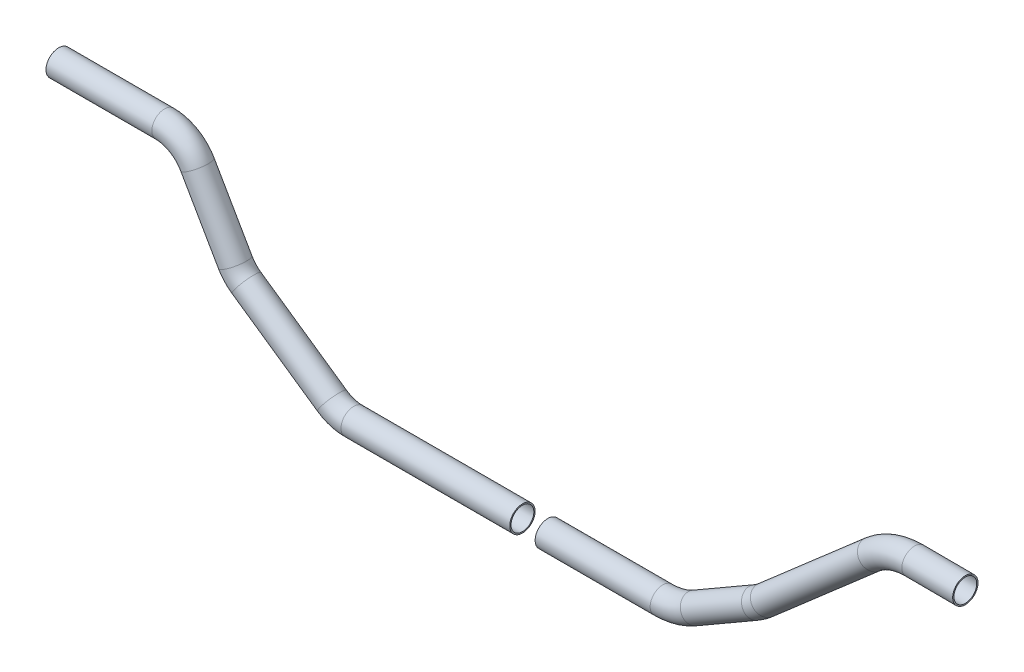
ISO-10303-21;
HEADER;
FILE_DESCRIPTION(('STEP AP214'),'2;1');
FILE_NAME('part.step','',(''),(''),'','','');
FILE_SCHEMA(('AUTOMOTIVE_DESIGN { 1 0 10303 214 1 1 1 1 }'));
ENDSEC;
DATA;
#1=APPLICATION_CONTEXT('core data for automotive mechanical design processes');
#2=APPLICATION_PROTOCOL_DEFINITION('international standard','automotive_design',2000,#1);
#3=PRODUCT_CONTEXT('',#1,'mechanical');
#4=PRODUCT('Part','Part','',(#3));
#5=PRODUCT_RELATED_PRODUCT_CATEGORY('part','',(#4));
#6=PRODUCT_DEFINITION_FORMATION('','',#4);
#7=PRODUCT_DEFINITION_CONTEXT('part definition',#1,'design');
#8=PRODUCT_DEFINITION('design','',#6,#7);
#9=PRODUCT_DEFINITION_SHAPE('','',#8);
#10=(LENGTH_UNIT() NAMED_UNIT(*) SI_UNIT(.MILLI.,.METRE.));
#11=(NAMED_UNIT(*) PLANE_ANGLE_UNIT() SI_UNIT($,.RADIAN.));
#12=(NAMED_UNIT(*) SI_UNIT($,.STERADIAN.) SOLID_ANGLE_UNIT());
#13=UNCERTAINTY_MEASURE_WITH_UNIT(LENGTH_MEASURE(1.E-05),#10,'distance_accuracy_value','');
#14=(GEOMETRIC_REPRESENTATION_CONTEXT(3) GLOBAL_UNCERTAINTY_ASSIGNED_CONTEXT((#13)) GLOBAL_UNIT_ASSIGNED_CONTEXT((#10,
#11,#12)) REPRESENTATION_CONTEXT('',''));
#15=CARTESIAN_POINT('',(0.,0.,0.));
#16=DIRECTION('',(0.,0.,1.));
#17=DIRECTION('',(1.,0.,0.));
#18=AXIS2_PLACEMENT_3D('',#15,#16,#17);
#19=CARTESIAN_POINT('',(30.0000000000037,-35.3695293030634,0.));
#20=DIRECTION('',(1.,0.,0.));
#21=DIRECTION('',(0.,1.,0.));
#22=AXIS2_PLACEMENT_3D('',#19,#20,#21);
#23=CYLINDRICAL_SURFACE('',#22,10.);
#24=CARTESIAN_POINT('',(-113.137610077227,-35.3695293030634,0.));
#25=DIRECTION('',(1.,0.,0.));
#26=DIRECTION('',(0.,0.,-1.));
#27=AXIS2_PLACEMENT_3D('',#24,#25,#26);
#28=CIRCLE('',#27,10.);
#29=CARTESIAN_POINT('',(-113.137610077227,-45.3695293030634,0.));
#30=VERTEX_POINT('',#29);
#31=EDGE_CURVE('E99',#30,#30,#28,.T.);
#32=ORIENTED_EDGE('',*,*,#31,.T.);
#33=EDGE_LOOP('',(#32));
#34=FACE_BOUND('',#33,.T.);
#35=CARTESIAN_POINT('',(20.000000000002,-35.3695293030633,0.));
#36=DIRECTION('',(-1.,0.,0.));
#37=DIRECTION('',(0.,-1.,0.));
#38=AXIS2_PLACEMENT_3D('',#35,#36,#37);
#39=CIRCLE('',#38,10.);
#40=CARTESIAN_POINT('',(20.000000000002,-45.3695293030633,0.));
#41=VERTEX_POINT('',#40);
#42=EDGE_CURVE('E67',#41,#41,#39,.T.);
#43=ORIENTED_EDGE('',*,*,#42,.T.);
#44=EDGE_LOOP('',(#43));
#45=FACE_BOUND('',#44,.T.);
#46=ADVANCED_FACE('F63',(#34,#45),#23,.T.);
#47=CARTESIAN_POINT('',(30.0000000000037,-35.3695293030634,0.));
#48=DIRECTION('',(1.,0.,0.));
#49=DIRECTION('',(0.,1.,0.));
#50=AXIS2_PLACEMENT_3D('',#47,#48,#49);
#51=CYLINDRICAL_SURFACE('',#50,9.);
#52=CARTESIAN_POINT('',(20.000000000002,-35.3695293030633,0.));
#53=DIRECTION('',(-1.,0.,0.));
#54=DIRECTION('',(0.,-1.,0.));
#55=AXIS2_PLACEMENT_3D('',#52,#53,#54);
#56=CIRCLE('',#55,9.);
#57=CARTESIAN_POINT('',(20.000000000002,-44.3695293030633,0.));
#58=VERTEX_POINT('',#57);
#59=EDGE_CURVE('E12',#58,#58,#56,.T.);
#60=ORIENTED_EDGE('',*,*,#59,.F.);
#61=EDGE_LOOP('',(#60));
#62=FACE_BOUND('',#61,.T.);
#63=CARTESIAN_POINT('',(-113.137610077227,-35.3695293030634,0.));
#64=DIRECTION('',(-1.,0.,0.));
#65=DIRECTION('',(0.,-1.,0.));
#66=AXIS2_PLACEMENT_3D('',#63,#64,#65);
#67=CIRCLE('',#66,9.);
#68=CARTESIAN_POINT('',(-113.137610077227,-44.3695293030634,0.));
#69=VERTEX_POINT('',#68);
#70=EDGE_CURVE('E82',#69,#69,#67,.F.);
#71=ORIENTED_EDGE('',*,*,#70,.F.);
#72=EDGE_LOOP('',(#71));
#73=FACE_BOUND('',#72,.T.);
#74=ADVANCED_FACE('F65',(#62,#73),#51,.F.);
#75=CARTESIAN_POINT('',(-345.844557130732,93.2555887111874,0.));
#76=DIRECTION('',(1.,0.,0.));
#77=DIRECTION('',(0.,0.,-1.));
#78=AXIS2_PLACEMENT_3D('',#75,#76,#77);
#79=PLANE('',#78);
#80=CARTESIAN_POINT('',(-345.844557130732,93.2555887111874,0.));
#81=DIRECTION('',(1.,0.,0.));
#82=DIRECTION('',(0.,0.,-1.));
#83=AXIS2_PLACEMENT_3D('',#80,#81,#82);
#84=CIRCLE('',#83,9.);
#85=CARTESIAN_POINT('',(-345.844557130732,93.2555887111874,-9.));
#86=VERTEX_POINT('',#85);
#87=EDGE_CURVE('E98',#86,#86,#84,.T.);
#88=ORIENTED_EDGE('',*,*,#87,.T.);
#89=EDGE_LOOP('',(#88));
#90=FACE_BOUND('',#89,.T.);
#91=CARTESIAN_POINT('',(-345.844557130732,93.2555887111874,0.));
#92=DIRECTION('',(1.,0.,0.));
#93=DIRECTION('',(0.,0.,-1.));
#94=AXIS2_PLACEMENT_3D('',#91,#92,#93);
#95=CIRCLE('',#94,10.);
#96=CARTESIAN_POINT('',(-345.844557130732,93.2555887111874,-10.));
#97=VERTEX_POINT('',#96);
#98=EDGE_CURVE('E79',#97,#97,#95,.T.);
#99=ORIENTED_EDGE('',*,*,#98,.F.);
#100=EDGE_LOOP('',(#99));
#101=FACE_BOUND('',#100,.T.);
#102=ADVANCED_FACE('F120',(#90,#101),#79,.F.);
#103=CARTESIAN_POINT('',(-113.137610077227,-5.36952930306338,0.));
#104=DIRECTION('',(0.,0.,-1.));
#105=DIRECTION('',(-1.,0.,0.));
#106=AXIS2_PLACEMENT_3D('',#103,#104,#105);
#107=TOROIDAL_SURFACE('',#106,30.,10.);
#108=CARTESIAN_POINT('',(-130.22224344056,-30.0295232779308,0.));
#109=DIRECTION('',(0.821999799162248,-0.569487778777757,0.));
#110=DIRECTION('',(0.,0.,-1.));
#111=AXIS2_PLACEMENT_3D('',#108,#109,#110);
#112=CIRCLE('',#111,10.);
#113=CARTESIAN_POINT('',(-135.917121228337,-38.2495212695534,0.));
#114=VERTEX_POINT('',#113);
#115=EDGE_CURVE('E95',#114,#114,#112,.T.);
#116=CARTESIAN_POINT('',(-113.137610077227,-5.36952930306338,0.));
#117=DIRECTION('',(0.,0.,-1.));
#118=DIRECTION('',(-1.,0.,0.));
#119=AXIS2_PLACEMENT_3D('',#116,#117,#118);
#120=CIRCLE('',#119,40.);
#121=EDGE_CURVE('',#30,#114,#120,.T.);
#122=ORIENTED_EDGE('',*,*,#31,.F.);
#123=ORIENTED_EDGE('',*,*,#115,.T.);
#124=ORIENTED_EDGE('',*,*,#121,.T.);
#125=ORIENTED_EDGE('',*,*,#121,.F.);
#126=EDGE_LOOP('',(#122,#124,#123,#125));
#127=FACE_BOUND('',#126,.T.);
#128=ADVANCED_FACE('F127',(#127),#107,.T.);
#129=CARTESIAN_POINT('',(-130.22224344056,-30.0295232779308,0.));
#130=DIRECTION('',(-0.821999799162248,0.569487778777757,0.));
#131=DIRECTION('',(-0.569487778777757,-0.821999799162249,0.));
#132=AXIS2_PLACEMENT_3D('',#129,#130,#131);
#133=CYLINDRICAL_SURFACE('',#132,10.);
#134=CARTESIAN_POINT('',(-197.656877085738,16.6897092163146,0.));
#135=DIRECTION('',(0.821999799162248,-0.569487778777757,0.));
#136=DIRECTION('',(0.,0.,-1.));
#137=AXIS2_PLACEMENT_3D('',#134,#135,#136);
#138=CIRCLE('',#137,10.);
#139=CARTESIAN_POINT('',(-203.351754873515,8.46971122469209,0.));
#140=VERTEX_POINT('',#139);
#141=EDGE_CURVE('E92',#140,#140,#138,.T.);
#142=ORIENTED_EDGE('',*,*,#141,.T.);
#143=EDGE_LOOP('',(#142));
#144=FACE_BOUND('',#143,.T.);
#145=ORIENTED_EDGE('',*,*,#115,.F.);
#146=EDGE_LOOP('',(#145));
#147=FACE_BOUND('',#146,.T.);
#148=ADVANCED_FACE('F155',(#144,#147),#133,.T.);
#149=CARTESIAN_POINT('',(-180.572243722405,41.349703191182,0.));
#150=DIRECTION('',(0.,0.,-1.));
#151=DIRECTION('',(-1.,0.,0.));
#152=AXIS2_PLACEMENT_3D('',#149,#150,#151);
#153=TOROIDAL_SURFACE('',#152,30.,10.);
#154=CARTESIAN_POINT('',(-206.586175299246,26.4073016467366,0.));
#155=DIRECTION('',(0.498080051481513,-0.867131052561361,0.));
#156=DIRECTION('',(0.,0.,-1.));
#157=AXIS2_PLACEMENT_3D('',#154,#155,#156);
#158=CIRCLE('',#157,10.);
#159=CARTESIAN_POINT('',(-215.257485824859,21.4265011319215,0.));
#160=VERTEX_POINT('',#159);
#161=EDGE_CURVE('E89',#160,#160,#158,.T.);
#162=CARTESIAN_POINT('',(-180.572243722405,41.349703191182,0.));
#163=DIRECTION('',(0.,0.,-1.));
#164=DIRECTION('',(-1.,0.,0.));
#165=AXIS2_PLACEMENT_3D('',#162,#163,#164);
#166=CIRCLE('',#165,40.);
#167=EDGE_CURVE('',#140,#160,#166,.T.);
#168=ORIENTED_EDGE('',*,*,#141,.F.);
#169=ORIENTED_EDGE('',*,*,#161,.T.);
#170=ORIENTED_EDGE('',*,*,#167,.T.);
#171=ORIENTED_EDGE('',*,*,#167,.F.);
#172=EDGE_LOOP('',(#168,#170,#169,#171));
#173=FACE_BOUND('',#172,.T.);
#174=ADVANCED_FACE('F151',(#173),#153,.T.);
#175=CARTESIAN_POINT('',(-206.586175299246,26.4073016467367,0.));
#176=DIRECTION('',(-0.498080051481514,0.86713105256136,0.));
#177=DIRECTION('',(-0.86713105256136,-0.498080051481514,0.));
#178=AXIS2_PLACEMENT_3D('',#175,#176,#177);
#179=CYLINDRICAL_SURFACE('',#178,10.);
#180=CARTESIAN_POINT('',(-236.33474533648,78.1979902556329,0.));
#181=DIRECTION('',(0.498080051481513,-0.867131052561361,0.));
#182=DIRECTION('',(0.,0.,-1.));
#183=AXIS2_PLACEMENT_3D('',#180,#181,#182);
#184=CIRCLE('',#183,10.);
#185=CARTESIAN_POINT('',(-227.663434810866,83.178790770448,0.));
#186=VERTEX_POINT('',#185);
#187=EDGE_CURVE('E86',#186,#186,#184,.T.);
#188=ORIENTED_EDGE('',*,*,#187,.T.);
#189=EDGE_LOOP('',(#188));
#190=FACE_BOUND('',#189,.T.);
#191=ORIENTED_EDGE('',*,*,#161,.F.);
#192=EDGE_LOOP('',(#191));
#193=FACE_BOUND('',#192,.T.);
#194=ADVANCED_FACE('F144',(#190,#193),#179,.T.);
#195=CARTESIAN_POINT('',(-262.348676913321,63.2555887111875,0.));
#196=DIRECTION('',(0.,0.,1.));
#197=DIRECTION('',(1.,0.,0.));
#198=AXIS2_PLACEMENT_3D('',#195,#196,#197);
#199=TOROIDAL_SURFACE('',#198,30.,10.);
#200=CARTESIAN_POINT('',(-262.348676913321,93.2555887111874,0.));
#201=DIRECTION('',(1.,0.,0.));
#202=DIRECTION('',(0.,0.,-1.));
#203=AXIS2_PLACEMENT_3D('',#200,#201,#202);
#204=CIRCLE('',#203,10.);
#205=CARTESIAN_POINT('',(-262.348676913321,103.255588711187,0.));
#206=VERTEX_POINT('',#205);
#207=EDGE_CURVE('E83',#206,#206,#204,.T.);
#208=CARTESIAN_POINT('',(-262.348676913321,63.2555887111875,0.));
#209=DIRECTION('',(0.,0.,1.));
#210=DIRECTION('',(1.,0.,0.));
#211=AXIS2_PLACEMENT_3D('',#208,#209,#210);
#212=CIRCLE('',#211,40.);
#213=EDGE_CURVE('',#186,#206,#212,.T.);
#214=ORIENTED_EDGE('',*,*,#187,.F.);
#215=ORIENTED_EDGE('',*,*,#207,.T.);
#216=ORIENTED_EDGE('',*,*,#213,.T.);
#217=ORIENTED_EDGE('',*,*,#213,.F.);
#218=EDGE_LOOP('',(#214,#216,#215,#217));
#219=FACE_BOUND('',#218,.T.);
#220=ADVANCED_FACE('F133',(#219),#199,.T.);
#221=CARTESIAN_POINT('',(-262.348676913321,93.2555887111875,0.));
#222=DIRECTION('',(-1.,0.,0.));
#223=DIRECTION('',(0.,-1.,0.));
#224=AXIS2_PLACEMENT_3D('',#221,#222,#223);
#225=CYLINDRICAL_SURFACE('',#224,10.);
#226=ORIENTED_EDGE('',*,*,#98,.T.);
#227=EDGE_LOOP('',(#226));
#228=FACE_BOUND('',#227,.T.);
#229=ORIENTED_EDGE('',*,*,#207,.F.);
#230=EDGE_LOOP('',(#229));
#231=FACE_BOUND('',#230,.T.);
#232=ADVANCED_FACE('F122',(#228,#231),#225,.T.);
#233=CARTESIAN_POINT('',(-113.137610077227,-5.36952930306338,0.));
#234=DIRECTION('',(0.,0.,-1.));
#235=DIRECTION('',(-1.,0.,0.));
#236=AXIS2_PLACEMENT_3D('',#233,#234,#235);
#237=TOROIDAL_SURFACE('',#236,30.,9.);
#238=CARTESIAN_POINT('',(-130.22224344056,-30.0295232779309,0.));
#239=DIRECTION('',(0.821999799162249,-0.569487778777756,0.));
#240=DIRECTION('',(0.569487778777756,0.821999799162249,0.));
#241=AXIS2_PLACEMENT_3D('',#238,#239,#240);
#242=CIRCLE('',#241,9.);
#243=CARTESIAN_POINT('',(-135.34763344956,-37.4275214703911,0.));
#244=VERTEX_POINT('',#243);
#245=EDGE_CURVE('E112',#244,#244,#242,.T.);
#246=CARTESIAN_POINT('',(-113.137610077227,-5.36952930306338,0.));
#247=DIRECTION('',(0.,0.,-1.));
#248=DIRECTION('',(-1.,0.,0.));
#249=AXIS2_PLACEMENT_3D('',#246,#247,#248);
#250=CIRCLE('',#249,39.);
#251=EDGE_CURVE('',#69,#244,#250,.T.);
#252=ORIENTED_EDGE('',*,*,#70,.T.);
#253=ORIENTED_EDGE('',*,*,#245,.F.);
#254=ORIENTED_EDGE('',*,*,#251,.T.);
#255=ORIENTED_EDGE('',*,*,#251,.F.);
#256=EDGE_LOOP('',(#252,#254,#253,#255));
#257=FACE_BOUND('',#256,.T.);
#258=ADVANCED_FACE('F117',(#257),#237,.F.);
#259=CARTESIAN_POINT('',(-130.22224344056,-30.0295232779308,0.));
#260=DIRECTION('',(-0.821999799162248,0.569487778777757,0.));
#261=DIRECTION('',(-0.569487778777757,-0.821999799162249,0.));
#262=AXIS2_PLACEMENT_3D('',#259,#260,#261);
#263=CYLINDRICAL_SURFACE('',#262,9.);
#264=CARTESIAN_POINT('',(-197.656877085738,16.6897092163146,0.));
#265=DIRECTION('',(-0.821999799162248,0.569487778777757,0.));
#266=DIRECTION('',(-0.569487778777757,-0.821999799162249,0.));
#267=AXIS2_PLACEMENT_3D('',#264,#265,#266);
#268=CIRCLE('',#267,9.);
#269=CARTESIAN_POINT('',(-202.782267094737,9.29171102385432,0.));
#270=VERTEX_POINT('',#269);
#271=EDGE_CURVE('E109',#270,#270,#268,.F.);
#272=CARTESIAN_POINT('',(-202.782267094737,9.29171102385432,0.));
#273=CARTESIAN_POINT('',(-202.079822994267,8.80505235203926,0.));
#274=CARTESIAN_POINT('',(-201.377378893796,8.31839368022421,0.));
#275=CARTESIAN_POINT('',(-199.972490692855,7.3450763365941,0.));
#276=CARTESIAN_POINT('',(-199.270046592384,6.85841766477904,0.));
#277=CARTESIAN_POINT('',(-197.865158391443,5.88510032114893,0.));
#278=CARTESIAN_POINT('',(-197.162714290973,5.39844164933388,0.));
#279=CARTESIAN_POINT('',(-195.757826090031,4.42512430570376,0.));
#280=CARTESIAN_POINT('',(-195.055381989561,3.9384656338887,0.));
#281=CARTESIAN_POINT('',(-193.65049378862,2.96514829025859,0.));
#282=CARTESIAN_POINT('',(-192.948049688149,2.47848961844353,0.));
#283=CARTESIAN_POINT('',(-191.543161487208,1.50517227481342,0.));
#284=CARTESIAN_POINT('',(-190.840717386737,1.01851360299836,0.));
#285=CARTESIAN_POINT('',(-189.435829185796,0.0451962593682555,0.));
#286=CARTESIAN_POINT('',(-188.733385085325,-0.441462412446796,0.));
#287=CARTESIAN_POINT('',(-187.328496884384,-1.41477975607691,0.));
#288=CARTESIAN_POINT('',(-186.626052783914,-1.90143842789197,0.));
#289=CARTESIAN_POINT('',(-185.221164582972,-2.87475577152209,0.));
#290=CARTESIAN_POINT('',(-184.518720482502,-3.36141444333714,0.));
#291=CARTESIAN_POINT('',(-183.11383228156,-4.33473178696725,0.));
#292=CARTESIAN_POINT('',(-182.41138818109,-4.82139045878231,0.));
#293=CARTESIAN_POINT('',(-181.006499980149,-5.79470780241242,0.));
#294=CARTESIAN_POINT('',(-180.304055879678,-6.28136647422748,0.));
#295=CARTESIAN_POINT('',(-178.899167678737,-7.25468381785759,0.));
#296=CARTESIAN_POINT('',(-178.196723578266,-7.74134248967265,0.));
#297=CARTESIAN_POINT('',(-176.791835377325,-8.71465983330276,0.));
#298=CARTESIAN_POINT('',(-176.089391276854,-9.20131850511782,0.));
#299=CARTESIAN_POINT('',(-174.684503075913,-10.1746358487479,0.));
#300=CARTESIAN_POINT('',(-173.982058975443,-10.661294520563,0.));
#301=CARTESIAN_POINT('',(-172.577170774501,-11.6346118641931,0.));
#302=CARTESIAN_POINT('',(-171.874726674031,-12.1212705360082,0.));
#303=CARTESIAN_POINT('',(-170.46983847309,-13.0945878796383,0.));
#304=CARTESIAN_POINT('',(-169.767394372619,-13.5812465514533,0.));
#305=CARTESIAN_POINT('',(-168.362506171678,-14.5545638950834,0.));
#306=CARTESIAN_POINT('',(-167.660062071207,-15.0412225668985,0.));
#307=CARTESIAN_POINT('',(-166.255173870266,-16.0145399105286,0.));
#308=CARTESIAN_POINT('',(-165.552729769795,-16.5011985823437,0.));
#309=CARTESIAN_POINT('',(-164.147841568854,-17.4745159259738,0.));
#310=CARTESIAN_POINT('',(-163.445397468384,-17.9611745977888,0.));
#311=CARTESIAN_POINT('',(-162.040509267442,-18.9344919414189,0.));
#312=CARTESIAN_POINT('',(-161.338065166972,-19.421150613234,0.));
#313=CARTESIAN_POINT('',(-159.933176966031,-20.3944679568641,0.));
#314=CARTESIAN_POINT('',(-159.23073286556,-20.8811266286792,0.));
#315=CARTESIAN_POINT('',(-157.825844664619,-21.8544439723093,0.));
#316=CARTESIAN_POINT('',(-157.123400564148,-22.3411026441243,0.));
#317=CARTESIAN_POINT('',(-155.718512363207,-23.3144199877545,0.));
#318=CARTESIAN_POINT('',(-155.016068262736,-23.8010786595695,0.));
#319=CARTESIAN_POINT('',(-153.611180061795,-24.7743960031996,0.));
#320=CARTESIAN_POINT('',(-152.908735961325,-25.2610546750147,0.));
#321=CARTESIAN_POINT('',(-151.503847760383,-26.2343720186448,0.));
#322=CARTESIAN_POINT('',(-150.801403659913,-26.7210306904598,0.));
#323=CARTESIAN_POINT('',(-149.396515458972,-27.69434803409,0.));
#324=CARTESIAN_POINT('',(-148.694071358501,-28.181006705905,0.));
#325=CARTESIAN_POINT('',(-147.28918315756,-29.1543240495351,0.));
#326=CARTESIAN_POINT('',(-146.586739057089,-29.6409827213502,0.));
#327=CARTESIAN_POINT('',(-145.181850856148,-30.6143000649803,0.));
#328=CARTESIAN_POINT('',(-144.479406755677,-31.1009587367953,0.));
#329=CARTESIAN_POINT('',(-143.074518554736,-32.0742760804255,0.));
#330=CARTESIAN_POINT('',(-142.372074454266,-32.5609347522405,0.));
#331=CARTESIAN_POINT('',(-140.967186253324,-33.5342520958706,0.));
#332=CARTESIAN_POINT('',(-140.264742152854,-34.0209107676857,0.));
#333=CARTESIAN_POINT('',(-138.859853951913,-34.9942281113158,0.));
#334=CARTESIAN_POINT('',(-138.157409851442,-35.4808867831309,0.));
#335=CARTESIAN_POINT('',(-136.752521650501,-36.454204126761,0.));
#336=CARTESIAN_POINT('',(-136.05007755003,-36.940862798576,0.));
#337=CARTESIAN_POINT('',(-135.34763344956,-37.4275214703911,0.));
#338=B_SPLINE_CURVE_WITH_KNOTS('',3,(#272,#273,#274,#275,#276,#277,#278,#279,#280,#281,#282,
#283,#284,#285,#286,#287,#288,#289,#290,#291,#292,#293,#294,#295,#296,#297,#298,#299,#300,#301,
#302,#303,#304,#305,#306,#307,#308,#309,#310,#311,#312,#313,#314,#315,#316,#317,#318,#319,#320,
#321,#322,#323,#324,#325,#326,#327,#328,#329,#330,#331,#332,#333,#334,#335,#336,#337),
.UNSPECIFIED.,.F.,.F.,(4,2,2,2,2,2,2,2,2,2,2,2,2,2,2,2,2,2,2,2,2,2,2,2,2,2,2,2,2,2,2,2,4),(0.,
2.56366522663329,5.1273304532666,7.69099567989989,10.2546609065332,12.8183261331665,
15.3819913597998,17.945656586433,20.5093218130663,23.0729870396996,25.6366522663329,
28.2003174929662,30.7639827195995,33.3276479462328,35.8913131728661,38.4549783994994,
41.0186436261327,43.582308852766,46.1459740793993,48.7096393060325,51.2733045326659,
53.8369697592992,56.4006349859324,58.9643002125657,61.527965439199,64.0916306658323,
66.6552958924656,69.2189611190989,71.7826263457322,74.3462915723655,76.9099567989988,
79.4736220256321,82.0372872522654),.UNSPECIFIED.);
#339=EDGE_CURVE('BSEAM140',#270,#244,#338,.T.);
#340=ORIENTED_EDGE('',*,*,#271,.F.);
#341=ORIENTED_EDGE('',*,*,#245,.T.);
#342=ORIENTED_EDGE('',*,*,#339,.T.);
#343=ORIENTED_EDGE('',*,*,#339,.F.);
#344=EDGE_LOOP('',(#340,#342,#341,#343));
#345=FACE_BOUND('',#344,.T.);
#346=ADVANCED_FACE('F140',(#345),#263,.F.);
#347=CARTESIAN_POINT('',(-180.572243722405,41.349703191182,0.));
#348=DIRECTION('',(0.,0.,-1.));
#349=DIRECTION('',(-1.,0.,0.));
#350=AXIS2_PLACEMENT_3D('',#347,#348,#349);
#351=TOROIDAL_SURFACE('',#350,30.,9.);
#352=CARTESIAN_POINT('',(-206.586175299246,26.4073016467366,0.));
#353=DIRECTION('',(0.498080051481514,-0.86713105256136,0.));
#354=DIRECTION('',(0.86713105256136,0.498080051481514,0.));
#355=AXIS2_PLACEMENT_3D('',#352,#353,#354);
#356=CIRCLE('',#355,9.);
#357=CARTESIAN_POINT('',(-214.390354772298,21.924581183403,0.));
#358=VERTEX_POINT('',#357);
#359=EDGE_CURVE('E106',#358,#358,#356,.T.);
#360=CARTESIAN_POINT('',(-180.572243722405,41.349703191182,0.));
#361=DIRECTION('',(0.,0.,-1.));
#362=DIRECTION('',(-1.,0.,0.));
#363=AXIS2_PLACEMENT_3D('',#360,#361,#362);
#364=CIRCLE('',#363,39.);
#365=EDGE_CURVE('',#270,#358,#364,.T.);
#366=ORIENTED_EDGE('',*,*,#271,.T.);
#367=ORIENTED_EDGE('',*,*,#359,.F.);
#368=ORIENTED_EDGE('',*,*,#365,.T.);
#369=ORIENTED_EDGE('',*,*,#365,.F.);
#370=EDGE_LOOP('',(#366,#368,#367,#369));
#371=FACE_BOUND('',#370,.T.);
#372=ADVANCED_FACE('F173',(#371),#351,.F.);
#373=CARTESIAN_POINT('',(-206.586175299246,26.4073016467367,0.));
#374=DIRECTION('',(-0.498080051481514,0.86713105256136,0.));
#375=DIRECTION('',(-0.86713105256136,-0.498080051481514,0.));
#376=AXIS2_PLACEMENT_3D('',#373,#374,#375);
#377=CYLINDRICAL_SURFACE('',#376,9.);
#378=CARTESIAN_POINT('',(-236.33474533648,78.1979902556329,0.));
#379=DIRECTION('',(-0.498080051481514,0.86713105256136,0.));
#380=DIRECTION('',(-0.86713105256136,-0.498080051481514,0.));
#381=AXIS2_PLACEMENT_3D('',#378,#379,#380);
#382=CIRCLE('',#381,9.);
#383=CARTESIAN_POINT('',(-228.530565863427,82.6807107189665,0.));
#384=VERTEX_POINT('',#383);
#385=EDGE_CURVE('E76',#384,#384,#382,.F.);
#386=ORIENTED_EDGE('',*,*,#385,.F.);
#387=EDGE_LOOP('',(#386));
#388=FACE_BOUND('',#387,.T.);
#389=ORIENTED_EDGE('',*,*,#359,.T.);
#390=EDGE_LOOP('',(#389));
#391=FACE_BOUND('',#390,.T.);
#392=ADVANCED_FACE('F169',(#388,#391),#377,.F.);
#393=CARTESIAN_POINT('',(-262.348676913321,63.2555887111875,0.));
#394=DIRECTION('',(0.,0.,1.));
#395=DIRECTION('',(1.,0.,0.));
#396=AXIS2_PLACEMENT_3D('',#393,#394,#395);
#397=TOROIDAL_SURFACE('',#396,30.,9.);
#398=CARTESIAN_POINT('',(-262.348676913321,93.2555887111874,0.));
#399=DIRECTION('',(1.,0.,0.));
#400=DIRECTION('',(0.,1.,0.));
#401=AXIS2_PLACEMENT_3D('',#398,#399,#400);
#402=CIRCLE('',#401,9.);
#403=CARTESIAN_POINT('',(-262.348676913321,102.255588711187,0.));
#404=VERTEX_POINT('',#403);
#405=EDGE_CURVE('E71',#404,#404,#402,.T.);
#406=CARTESIAN_POINT('',(-262.348676913321,63.2555887111875,0.));
#407=DIRECTION('',(0.,0.,1.));
#408=DIRECTION('',(1.,0.,0.));
#409=AXIS2_PLACEMENT_3D('',#406,#407,#408);
#410=CIRCLE('',#409,39.);
#411=EDGE_CURVE('',#384,#404,#410,.T.);
#412=ORIENTED_EDGE('',*,*,#385,.T.);
#413=ORIENTED_EDGE('',*,*,#405,.F.);
#414=ORIENTED_EDGE('',*,*,#411,.T.);
#415=ORIENTED_EDGE('',*,*,#411,.F.);
#416=EDGE_LOOP('',(#412,#414,#413,#415));
#417=FACE_BOUND('',#416,.T.);
#418=ADVANCED_FACE('F165',(#417),#397,.F.);
#419=CARTESIAN_POINT('',(-262.348676913321,93.2555887111875,0.));
#420=DIRECTION('',(-1.,0.,0.));
#421=DIRECTION('',(0.,-1.,0.));
#422=AXIS2_PLACEMENT_3D('',#419,#420,#421);
#423=CYLINDRICAL_SURFACE('',#422,9.);
#424=ORIENTED_EDGE('',*,*,#87,.F.);
#425=EDGE_LOOP('',(#424));
#426=FACE_BOUND('',#425,.T.);
#427=ORIENTED_EDGE('',*,*,#405,.T.);
#428=EDGE_LOOP('',(#427));
#429=FACE_BOUND('',#428,.T.);
#430=ADVANCED_FACE('F130',(#426,#429),#423,.F.);
#431=CARTESIAN_POINT('',(20.000000000002,-15.8292536902672,-10.));
#432=DIRECTION('',(-1.,0.,0.));
#433=DIRECTION('',(0.,-1.,0.));
#434=AXIS2_PLACEMENT_3D('',#431,#432,#433);
#435=PLANE('',#434);
#436=ORIENTED_EDGE('',*,*,#59,.T.);
#437=EDGE_LOOP('',(#436));
#438=FACE_BOUND('',#437,.T.);
#439=ORIENTED_EDGE('',*,*,#42,.F.);
#440=EDGE_LOOP('',(#439));
#441=FACE_BOUND('',#440,.T.);
#442=ADVANCED_FACE('F143',(#438,#441),#435,.F.);
#443=CLOSED_SHELL('',(#46,#74,#102,#128,#148,#174,#194,#220,#232,#258,#346,#372,#392,#418,#430,#442));
#444=MANIFOLD_SOLID_BREP('B2',#443);
#445=CARTESIAN_POINT('',(329.28564185792,90.5046449903837,0.));
#446=DIRECTION('',(0.999989067430513,-0.0046760046464724,0.));
#447=DIRECTION('',(0.0046760046464724,0.999989067430513,0.));
#448=AXIS2_PLACEMENT_3D('',#445,#446,#447);
#449=CYLINDRICAL_SURFACE('',#448,10.);
#450=CARTESIAN_POINT('',(369.35801180061,90.3172643537847,0.));
#451=DIRECTION('',(-0.999989067430513,0.00467600464647312,0.));
#452=DIRECTION('',(-0.00467600464647312,-0.999989067430513,0.));
#453=AXIS2_PLACEMENT_3D('',#450,#451,#452);
#454=CIRCLE('',#453,10.);
#455=CARTESIAN_POINT('',(369.404771847075,100.31715502809,0.));
#456=VERTEX_POINT('',#455);
#457=EDGE_CURVE('E62',#456,#456,#454,.T.);
#458=CARTESIAN_POINT('',(329.28564185792,90.5046449903836,0.));
#459=DIRECTION('',(-0.999989067430513,0.00467600464647312,0.));
#460=DIRECTION('',(-0.00467600464647312,-0.999989067430513,0.));
#461=AXIS2_PLACEMENT_3D('',#458,#459,#460);
#462=CIRCLE('',#461,10.);
#463=CARTESIAN_POINT('',(329.332401904385,100.504535664689,0.));
#464=VERTEX_POINT('',#463);
#465=EDGE_CURVE('E319',#464,#464,#462,.T.);
#466=CARTESIAN_POINT('',(369.404771847075,100.31715502809,0.));
#467=CARTESIAN_POINT('',(368.987351326839,100.319106909721,0.));
#468=CARTESIAN_POINT('',(368.569930806602,100.321058791352,0.));
#469=CARTESIAN_POINT('',(367.73508976613,100.324962554615,0.));
#470=CARTESIAN_POINT('',(367.317669245893,100.326914436246,0.));
#471=CARTESIAN_POINT('',(366.482828205421,100.330818199508,0.));
#472=CARTESIAN_POINT('',(366.065407685184,100.33277008114,0.));
#473=CARTESIAN_POINT('',(365.230566644711,100.336673844402,0.));
#474=CARTESIAN_POINT('',(364.813146124475,100.338625726033,0.));
#475=CARTESIAN_POINT('',(363.978305084002,100.342529489296,0.));
#476=CARTESIAN_POINT('',(363.560884563766,100.344481370927,0.));
#477=CARTESIAN_POINT('',(362.726043523293,100.34838513419,0.));
#478=CARTESIAN_POINT('',(362.308623003057,100.350337015821,0.));
#479=CARTESIAN_POINT('',(361.473781962584,100.354240779083,0.));
#480=CARTESIAN_POINT('',(361.056361442348,100.356192660715,0.));
#481=CARTESIAN_POINT('',(360.221520401875,100.360096423977,0.));
#482=CARTESIAN_POINT('',(359.804099881639,100.362048305608,0.));
#483=CARTESIAN_POINT('',(358.969258841166,100.365952068871,0.));
#484=CARTESIAN_POINT('',(358.55183832093,100.367903950502,0.));
#485=CARTESIAN_POINT('',(357.716997280457,100.371807713765,0.));
#486=CARTESIAN_POINT('',(357.299576760221,100.373759595396,0.));
#487=CARTESIAN_POINT('',(356.464735719748,100.377663358658,0.));
#488=CARTESIAN_POINT('',(356.047315199512,100.379615240289,0.));
#489=CARTESIAN_POINT('',(355.212474159039,100.383519003552,0.));
#490=CARTESIAN_POINT('',(354.795053638803,100.385470885183,0.));
#491=CARTESIAN_POINT('',(353.96021259833,100.389374648446,0.));
#492=CARTESIAN_POINT('',(353.542792078093,100.391326530077,0.));
#493=CARTESIAN_POINT('',(352.707951037621,100.395230293339,0.));
#494=CARTESIAN_POINT('',(352.290530517384,100.397182174971,0.));
#495=CARTESIAN_POINT('',(351.455689476912,100.401085938233,0.));
#496=CARTESIAN_POINT('',(351.038268956675,100.403037819864,0.));
#497=CARTESIAN_POINT('',(350.203427916203,100.406941583127,0.));
#498=CARTESIAN_POINT('',(349.786007395966,100.408893464758,0.));
#499=CARTESIAN_POINT('',(348.951166355494,100.412797228021,0.));
#500=CARTESIAN_POINT('',(348.533745835257,100.414749109652,0.));
#501=CARTESIAN_POINT('',(347.698904794784,100.418652872914,0.));
#502=CARTESIAN_POINT('',(347.281484274548,100.420604754546,0.));
#503=CARTESIAN_POINT('',(346.446643234075,100.424508517808,0.));
#504=CARTESIAN_POINT('',(346.029222713839,100.426460399439,0.));
#505=CARTESIAN_POINT('',(345.194381673366,100.430364162702,0.));
#506=CARTESIAN_POINT('',(344.77696115313,100.432316044333,0.));
#507=CARTESIAN_POINT('',(343.942120112657,100.436219807595,0.));
#508=CARTESIAN_POINT('',(343.524699592421,100.438171689227,0.));
#509=CARTESIAN_POINT('',(342.689858551948,100.442075452489,0.));
#510=CARTESIAN_POINT('',(342.272438031712,100.44402733412,0.));
#511=CARTESIAN_POINT('',(341.437596991239,100.447931097383,0.));
#512=CARTESIAN_POINT('',(341.020176471003,100.449882979014,0.));
#513=CARTESIAN_POINT('',(340.18533543053,100.453786742277,0.));
#514=CARTESIAN_POINT('',(339.767914910294,100.455738623908,0.));
#515=CARTESIAN_POINT('',(338.933073869821,100.45964238717,0.));
#516=CARTESIAN_POINT('',(338.515653349585,100.461594268802,0.));
#517=CARTESIAN_POINT('',(337.680812309112,100.465498032064,0.));
#518=CARTESIAN_POINT('',(337.263391788876,100.467449913695,0.));
#519=CARTESIAN_POINT('',(336.428550748403,100.471353676958,0.));
#520=CARTESIAN_POINT('',(336.011130228166,100.473305558589,0.));
#521=CARTESIAN_POINT('',(335.176289187694,100.477209321851,0.));
#522=CARTESIAN_POINT('',(334.758868667457,100.479161203483,0.));
#523=CARTESIAN_POINT('',(333.924027626985,100.483064966745,0.));
#524=CARTESIAN_POINT('',(333.506607106748,100.485016848376,0.));
#525=CARTESIAN_POINT('',(332.671766066276,100.488920611639,0.));
#526=CARTESIAN_POINT('',(332.254345546039,100.49087249327,0.));
#527=CARTESIAN_POINT('',(331.419504505567,100.494776256533,0.));
#528=CARTESIAN_POINT('',(331.00208398533,100.496728138164,0.));
#529=CARTESIAN_POINT('',(330.167242944857,100.500631901426,0.));
#530=CARTESIAN_POINT('',(329.749822424621,100.502583783058,0.));
#531=CARTESIAN_POINT('',(329.332401904385,100.504535664689,0.));
#532=B_SPLINE_CURVE_WITH_KNOTS('',3,(#466,#467,#468,#469,#470,#471,#472,#473,#474,#475,#476,
#477,#478,#479,#480,#481,#482,#483,#484,#485,#486,#487,#488,#489,#490,#491,#492,#493,#494,#495,
#496,#497,#498,#499,#500,#501,#502,#503,#504,#505,#506,#507,#508,#509,#510,#511,#512,#513,#514,
#515,#516,#517,#518,#519,#520,#521,#522,#523,#524,#525,#526,#527,#528,#529,#530,#531),
.UNSPECIFIED.,.F.,.F.,(4,2,2,2,2,2,2,2,2,2,2,2,2,2,2,2,2,2,2,2,2,2,2,2,2,2,2,2,2,2,2,2,4),(0.,
1.25227525129527,2.50455050259054,3.75682575388581,5.00910100518108,6.26137625647635,
7.51365150777162,8.76592675906688,10.0182020103622,11.2704772616574,12.5227525129527,
13.775027764248,15.0273030155433,16.2795782668386,17.5318535181338,18.7841287694291,
20.0364040207244,21.2886792720196,22.5409545233149,23.7932297746102,25.0455050259054,
26.2977802772008,27.550055528496,28.8023307797913,30.0546060310866,31.3068812823818,
32.5591565336771,33.8114317849724,35.0637070362677,36.3159822875629,37.5682575388582,
38.8205327901535,40.0728080414487),.UNSPECIFIED.);
#533=EDGE_CURVE('BSEAM311',#456,#464,#532,.T.);
#534=ORIENTED_EDGE('',*,*,#457,.T.);
#535=ORIENTED_EDGE('',*,*,#465,.F.);
#536=ORIENTED_EDGE('',*,*,#533,.T.);
#537=ORIENTED_EDGE('',*,*,#533,.F.);
#538=EDGE_LOOP('',(#534,#536,#535,#537));
#539=FACE_BOUND('',#538,.T.);
#540=ADVANCED_FACE('F311',(#539),#449,.T.);
#541=CARTESIAN_POINT('',(329.051841625597,40.505191618858,0.));
#542=DIRECTION('',(0.,0.,-1.));
#543=DIRECTION('',(-1.,0.,0.));
#544=AXIS2_PLACEMENT_3D('',#541,#542,#543);
#545=TOROIDAL_SURFACE('',#544,50.0000000000001,10.);
#546=CARTESIAN_POINT('',(296.234525798211,78.2281790653165,0.));
#547=DIRECTION('',(-0.75445974892917,-0.6563463165477,0.));
#548=DIRECTION('',(0.6563463165477,-0.75445974892917,0.));
#549=AXIS2_PLACEMENT_3D('',#546,#547,#548);
#550=CIRCLE('',#549,10.);
#551=CARTESIAN_POINT('',(289.671062632734,85.7727765546082,0.));
#552=VERTEX_POINT('',#551);
#553=EDGE_CURVE('E323',#552,#552,#550,.T.);
#554=CARTESIAN_POINT('',(329.051841625597,40.505191618858,0.));
#555=DIRECTION('',(0.,0.,-1.));
#556=DIRECTION('',(-1.,0.,0.));
#557=AXIS2_PLACEMENT_3D('',#554,#555,#556);
#558=CIRCLE('',#557,60.0000000000001);
#559=EDGE_CURVE('',#552,#464,#558,.T.);
#560=ORIENTED_EDGE('',*,*,#553,.F.);
#561=ORIENTED_EDGE('',*,*,#465,.T.);
#562=ORIENTED_EDGE('',*,*,#559,.T.);
#563=ORIENTED_EDGE('',*,*,#559,.F.);
#564=EDGE_LOOP('',(#560,#562,#561,#563));
#565=FACE_BOUND('',#564,.T.);
#566=ADVANCED_FACE('F390',(#565),#545,.T.);
#567=CARTESIAN_POINT('',(211.793997813692,4.7686875700515,0.));
#568=DIRECTION('',(0.754459748929169,0.656346316547701,0.));
#569=DIRECTION('',(-0.656346316547701,0.75445974892917,0.));
#570=AXIS2_PLACEMENT_3D('',#567,#568,#569);
#571=CYLINDRICAL_SURFACE('',#570,10.);
#572=ORIENTED_EDGE('',*,*,#553,.T.);
#573=EDGE_LOOP('',(#572));
#574=FACE_BOUND('',#573,.T.);
#575=CARTESIAN_POINT('',(211.793997813692,4.7686875700515,0.));
#576=DIRECTION('',(-0.75445974892917,-0.6563463165477,0.));
#577=DIRECTION('',(0.6563463165477,-0.75445974892917,0.));
#578=AXIS2_PLACEMENT_3D('',#575,#576,#577);
#579=CIRCLE('',#578,10.);
#580=CARTESIAN_POINT('',(218.357460979169,-2.77590991924023,0.));
#581=VERTEX_POINT('',#580);
#582=EDGE_CURVE('E328',#581,#581,#579,.T.);
#583=ORIENTED_EDGE('',*,*,#582,.F.);
#584=EDGE_LOOP('',(#583));
#585=FACE_BOUND('',#584,.T.);
#586=ADVANCED_FACE('F394',(#574,#585),#571,.T.);
#587=CARTESIAN_POINT('',(178.976681986307,42.49167501651,0.));
#588=DIRECTION('',(0.,0.,1.));
#589=DIRECTION('',(1.,0.,0.));
#590=AXIS2_PLACEMENT_3D('',#587,#588,#589);
#591=TOROIDAL_SURFACE('',#590,50.,10.);
#592=CARTESIAN_POINT('',(203.976681986307,-0.809595172711897,0.));
#593=DIRECTION('',(-0.866025403784438,-0.500000000000001,0.));
#594=DIRECTION('',(0.500000000000001,-0.866025403784438,0.));
#595=AXIS2_PLACEMENT_3D('',#592,#593,#594);
#596=CIRCLE('',#595,10.);
#597=CARTESIAN_POINT('',(208.976681986307,-9.46984921055631,0.));
#598=VERTEX_POINT('',#597);
#599=EDGE_CURVE('E331',#598,#598,#596,.T.);
#600=CARTESIAN_POINT('',(178.976681986307,42.49167501651,0.));
#601=DIRECTION('',(0.,0.,1.));
#602=DIRECTION('',(1.,0.,0.));
#603=AXIS2_PLACEMENT_3D('',#600,#601,#602);
#604=CIRCLE('',#603,60.);
#605=EDGE_CURVE('',#598,#581,#604,.T.);
#606=ORIENTED_EDGE('',*,*,#599,.F.);
#607=ORIENTED_EDGE('',*,*,#582,.T.);
#608=ORIENTED_EDGE('',*,*,#605,.T.);
#609=ORIENTED_EDGE('',*,*,#605,.F.);
#610=EDGE_LOOP('',(#606,#608,#607,#609));
#611=FACE_BOUND('',#610,.T.);
#612=ADVANCED_FACE('F401',(#611),#591,.T.);
#613=CARTESIAN_POINT('',(155.719660544748,-28.6707994922861,0.));
#614=DIRECTION('',(0.866025403784438,0.500000000000001,0.));
#615=DIRECTION('',(-0.500000000000001,0.866025403784438,0.));
#616=AXIS2_PLACEMENT_3D('',#613,#614,#615);
#617=CYLINDRICAL_SURFACE('',#616,10.);
#618=ORIENTED_EDGE('',*,*,#599,.T.);
#619=EDGE_LOOP('',(#618));
#620=FACE_BOUND('',#619,.T.);
#621=CARTESIAN_POINT('',(155.719660544748,-28.6707994922861,0.));
#622=DIRECTION('',(-0.866025403784439,-0.500000000000001,0.));
#623=DIRECTION('',(0.5,-0.866025403784439,0.));
#624=AXIS2_PLACEMENT_3D('',#621,#622,#623);
#625=CIRCLE('',#624,10.);
#626=CARTESIAN_POINT('',(160.719660544748,-37.3310535301305,0.));
#627=VERTEX_POINT('',#626);
#628=EDGE_CURVE('E334',#627,#627,#625,.T.);
#629=ORIENTED_EDGE('',*,*,#628,.F.);
#630=EDGE_LOOP('',(#629));
#631=FACE_BOUND('',#630,.T.);
#632=ADVANCED_FACE('F405',(#620,#631),#617,.T.);
#633=CARTESIAN_POINT('',(130.719660544748,14.6304706969358,0.));
#634=DIRECTION('',(0.,0.,1.));
#635=DIRECTION('',(1.,0.,0.));
#636=AXIS2_PLACEMENT_3D('',#633,#634,#635);
#637=TOROIDAL_SURFACE('',#636,50.,10.);
#638=CARTESIAN_POINT('',(130.719660544748,-35.3695293030643,0.));
#639=DIRECTION('',(-1.,0.,0.));
#640=DIRECTION('',(0.,-1.,0.));
#641=AXIS2_PLACEMENT_3D('',#638,#639,#640);
#642=CIRCLE('',#641,10.);
#643=CARTESIAN_POINT('',(130.719660544747,-45.3695293030642,0.));
#644=VERTEX_POINT('',#643);
#645=EDGE_CURVE('E337',#644,#644,#642,.T.);
#646=CARTESIAN_POINT('',(130.719660544748,14.6304706969358,0.));
#647=DIRECTION('',(0.,0.,1.));
#648=DIRECTION('',(1.,0.,0.));
#649=AXIS2_PLACEMENT_3D('',#646,#647,#648);
#650=CIRCLE('',#649,60.);
#651=EDGE_CURVE('',#644,#627,#650,.T.);
#652=ORIENTED_EDGE('',*,*,#645,.F.);
#653=ORIENTED_EDGE('',*,*,#628,.T.);
#654=ORIENTED_EDGE('',*,*,#651,.T.);
#655=ORIENTED_EDGE('',*,*,#651,.F.);
#656=EDGE_LOOP('',(#652,#654,#653,#655));
#657=FACE_BOUND('',#656,.T.);
#658=ADVANCED_FACE('F409',(#657),#637,.T.);
#659=CARTESIAN_POINT('',(30.0000000000037,-35.3695293030634,0.));
#660=DIRECTION('',(1.,0.,0.));
#661=DIRECTION('',(0.,1.,0.));
#662=AXIS2_PLACEMENT_3D('',#659,#660,#661);
#663=CYLINDRICAL_SURFACE('',#662,10.);
#664=CARTESIAN_POINT('',(40.000000000002,-35.3695293030635,0.));
#665=DIRECTION('',(1.,0.,0.));
#666=DIRECTION('',(0.,0.,-1.));
#667=AXIS2_PLACEMENT_3D('',#664,#665,#666);
#668=CIRCLE('',#667,10.);
#669=CARTESIAN_POINT('',(40.000000000002,-35.3695293030635,-10.));
#670=VERTEX_POINT('',#669);
#671=EDGE_CURVE('E361',#670,#670,#668,.T.);
#672=ORIENTED_EDGE('',*,*,#671,.T.);
#673=EDGE_LOOP('',(#672));
#674=FACE_BOUND('',#673,.T.);
#675=ORIENTED_EDGE('',*,*,#645,.T.);
#676=EDGE_LOOP('',(#675));
#677=FACE_BOUND('',#676,.T.);
#678=ADVANCED_FACE('F413',(#674,#677),#663,.T.);
#679=CARTESIAN_POINT('',(369.35801180061,90.3172643537847,0.));
#680=DIRECTION('',(-0.999989067430513,0.00467600464647312,0.));
#681=DIRECTION('',(-0.00467600464647312,-0.999989067430513,0.));
#682=AXIS2_PLACEMENT_3D('',#679,#680,#681);
#683=PLANE('',#682);
#684=CARTESIAN_POINT('',(369.35801180061,90.3172643537847,0.));
#685=DIRECTION('',(-0.999989067430513,0.00467600464647312,0.));
#686=DIRECTION('',(-0.00467600464647312,-0.999989067430513,0.));
#687=AXIS2_PLACEMENT_3D('',#684,#685,#686);
#688=CIRCLE('',#687,9.);
#689=CARTESIAN_POINT('',(369.400095842429,99.3171659606593,0.));
#690=VERTEX_POINT('',#689);
#691=EDGE_CURVE('E340',#690,#690,#688,.T.);
#692=ORIENTED_EDGE('',*,*,#691,.T.);
#693=EDGE_LOOP('',(#692));
#694=FACE_BOUND('',#693,.T.);
#695=ORIENTED_EDGE('',*,*,#457,.F.);
#696=EDGE_LOOP('',(#695));
#697=FACE_BOUND('',#696,.T.);
#698=ADVANCED_FACE('F313',(#694,#697),#683,.F.);
#699=CARTESIAN_POINT('',(329.28564185792,90.5046449903837,0.));
#700=DIRECTION('',(0.999989067430513,-0.0046760046464724,0.));
#701=DIRECTION('',(0.0046760046464724,0.999989067430513,0.));
#702=AXIS2_PLACEMENT_3D('',#699,#700,#701);
#703=CYLINDRICAL_SURFACE('',#702,9.);
#704=CARTESIAN_POINT('',(329.28564185792,90.5046449903837,0.));
#705=DIRECTION('',(-0.999989067430513,0.00467600464647089,0.));
#706=DIRECTION('',(-0.00467600464647089,-0.999989067430513,0.));
#707=AXIS2_PLACEMENT_3D('',#704,#705,#706);
#708=CIRCLE('',#707,9.);
#709=CARTESIAN_POINT('',(329.327725899738,99.5045465972583,0.));
#710=VERTEX_POINT('',#709);
#711=EDGE_CURVE('E343',#710,#710,#708,.T.);
#712=CARTESIAN_POINT('',(369.400095842429,99.3171659606593,0.));
#713=CARTESIAN_POINT('',(368.982675322192,99.3191178422905,0.));
#714=CARTESIAN_POINT('',(368.565254801956,99.3210697239218,0.));
#715=CARTESIAN_POINT('',(367.730413761483,99.3249734871843,0.));
#716=CARTESIAN_POINT('',(367.312993241247,99.3269253688155,0.));
#717=CARTESIAN_POINT('',(366.478152200774,99.330829132078,0.));
#718=CARTESIAN_POINT('',(366.060731680538,99.3327810137092,0.));
#719=CARTESIAN_POINT('',(365.225890640065,99.3366847769717,0.));
#720=CARTESIAN_POINT('',(364.808470119829,99.3386366586029,0.));
#721=CARTESIAN_POINT('',(363.973629079356,99.3425404218654,0.));
#722=CARTESIAN_POINT('',(363.55620855912,99.3444923034966,0.));
#723=CARTESIAN_POINT('',(362.721367518647,99.3483960667591,0.));
#724=CARTESIAN_POINT('',(362.30394699841,99.3503479483904,0.));
#725=CARTESIAN_POINT('',(361.469105957938,99.3542517116528,0.));
#726=CARTESIAN_POINT('',(361.051685437701,99.3562035932841,0.));
#727=CARTESIAN_POINT('',(360.216844397229,99.3601073565466,0.));
#728=CARTESIAN_POINT('',(359.799423876992,99.3620592381778,0.));
#729=CARTESIAN_POINT('',(358.96458283652,99.3659630014403,0.));
#730=CARTESIAN_POINT('',(358.547162316283,99.3679148830715,0.));
#731=CARTESIAN_POINT('',(357.712321275811,99.371818646334,0.));
#732=CARTESIAN_POINT('',(357.294900755574,99.3737705279652,0.));
#733=CARTESIAN_POINT('',(356.460059715102,99.3776742912277,0.));
#734=CARTESIAN_POINT('',(356.042639194865,99.379626172859,0.));
#735=CARTESIAN_POINT('',(355.207798154392,99.3835299361214,0.));
#736=CARTESIAN_POINT('',(354.790377634156,99.3854818177527,0.));
#737=CARTESIAN_POINT('',(353.955536593683,99.3893855810151,0.));
#738=CARTESIAN_POINT('',(353.538116073447,99.3913374626464,0.));
#739=CARTESIAN_POINT('',(352.703275032974,99.3952412259089,0.));
#740=CARTESIAN_POINT('',(352.285854512738,99.3971931075401,0.));
#741=CARTESIAN_POINT('',(351.451013472265,99.4010968708026,0.));
#742=CARTESIAN_POINT('',(351.033592952029,99.4030487524338,0.));
#743=CARTESIAN_POINT('',(350.198751911556,99.4069525156963,0.));
#744=CARTESIAN_POINT('',(349.78133139132,99.4089043973275,0.));
#745=CARTESIAN_POINT('',(348.946490350847,99.41280816059,0.));
#746=CARTESIAN_POINT('',(348.529069830611,99.4147600422213,0.));
#747=CARTESIAN_POINT('',(347.694228790138,99.4186638054838,0.));
#748=CARTESIAN_POINT('',(347.276808269902,99.420615687115,0.));
#749=CARTESIAN_POINT('',(346.441967229429,99.4245194503775,0.));
#750=CARTESIAN_POINT('',(346.024546709193,99.4264713320087,0.));
#751=CARTESIAN_POINT('',(345.18970566872,99.4303750952712,0.));
#752=CARTESIAN_POINT('',(344.772285148483,99.4323269769024,0.));
#753=CARTESIAN_POINT('',(343.937444108011,99.4362307401649,0.));
#754=CARTESIAN_POINT('',(343.520023587774,99.4381826217961,0.));
#755=CARTESIAN_POINT('',(342.685182547302,99.4420863850586,0.));
#756=CARTESIAN_POINT('',(342.267762027065,99.4440382666899,0.));
#757=CARTESIAN_POINT('',(341.432920986593,99.4479420299523,0.));
#758=CARTESIAN_POINT('',(341.015500466356,99.4498939115836,0.));
#759=CARTESIAN_POINT('',(340.180659425884,99.4537976748461,0.));
#760=CARTESIAN_POINT('',(339.763238905647,99.4557495564773,0.));
#761=CARTESIAN_POINT('',(338.928397865175,99.4596533197398,0.));
#762=CARTESIAN_POINT('',(338.510977344938,99.461605201371,0.));
#763=CARTESIAN_POINT('',(337.676136304465,99.4655089646335,0.));
#764=CARTESIAN_POINT('',(337.258715784229,99.4674608462647,0.));
#765=CARTESIAN_POINT('',(336.423874743756,99.4713646095272,0.));
#766=CARTESIAN_POINT('',(336.00645422352,99.4733164911585,0.));
#767=CARTESIAN_POINT('',(335.171613183047,99.4772202544209,0.));
#768=CARTESIAN_POINT('',(334.754192662811,99.4791721360522,0.));
#769=CARTESIAN_POINT('',(333.919351622338,99.4830758993147,0.));
#770=CARTESIAN_POINT('',(333.501931102102,99.4850277809459,0.));
#771=CARTESIAN_POINT('',(332.667090061629,99.4889315442084,0.));
#772=CARTESIAN_POINT('',(332.249669541393,99.4908834258396,0.));
#773=CARTESIAN_POINT('',(331.41482850092,99.4947871891021,0.));
#774=CARTESIAN_POINT('',(330.997407980684,99.4967390707333,0.));
#775=CARTESIAN_POINT('',(330.162566940211,99.5006428339958,0.));
#776=CARTESIAN_POINT('',(329.745146419975,99.5025947156271,0.));
#777=CARTESIAN_POINT('',(329.327725899738,99.5045465972583,0.));
#778=B_SPLINE_CURVE_WITH_KNOTS('',3,(#712,#713,#714,#715,#716,#717,#718,#719,#720,#721,#722,
#723,#724,#725,#726,#727,#728,#729,#730,#731,#732,#733,#734,#735,#736,#737,#738,#739,#740,#741,
#742,#743,#744,#745,#746,#747,#748,#749,#750,#751,#752,#753,#754,#755,#756,#757,#758,#759,#760,
#761,#762,#763,#764,#765,#766,#767,#768,#769,#770,#771,#772,#773,#774,#775,#776,#777),
.UNSPECIFIED.,.F.,.F.,(4,2,2,2,2,2,2,2,2,2,2,2,2,2,2,2,2,2,2,2,2,2,2,2,2,2,2,2,2,2,2,2,4),(0.,
1.25227525129527,2.50455050259054,3.75682575388581,5.00910100518108,6.26137625647635,
7.51365150777162,8.76592675906688,10.0182020103622,11.2704772616574,12.5227525129527,
13.775027764248,15.0273030155432,16.2795782668385,17.5318535181338,18.784128769429,
20.0364040207244,21.2886792720196,22.5409545233149,23.7932297746102,25.0455050259054,
26.2977802772007,27.550055528496,28.8023307797913,30.0546060310865,31.3068812823818,
32.5591565336771,33.8114317849723,35.0637070362676,36.3159822875629,37.5682575388581,
38.8205327901534,40.0728080414487),.UNSPECIFIED.);
#779=EDGE_CURVE('BSEAM417',#690,#710,#778,.T.);
#780=ORIENTED_EDGE('',*,*,#691,.F.);
#781=ORIENTED_EDGE('',*,*,#711,.T.);
#782=ORIENTED_EDGE('',*,*,#779,.T.);
#783=ORIENTED_EDGE('',*,*,#779,.F.);
#784=EDGE_LOOP('',(#780,#782,#781,#783));
#785=FACE_BOUND('',#784,.T.);
#786=ADVANCED_FACE('F417',(#785),#703,.F.);
#787=CARTESIAN_POINT('',(329.051841625597,40.505191618858,0.));
#788=DIRECTION('',(0.,0.,-1.));
#789=DIRECTION('',(-1.,0.,0.));
#790=AXIS2_PLACEMENT_3D('',#787,#788,#789);
#791=TOROIDAL_SURFACE('',#790,50.0000000000001,9.);
#792=CARTESIAN_POINT('',(296.234525798211,78.2281790653165,0.));
#793=DIRECTION('',(0.754459748929169,0.656346316547701,0.));
#794=DIRECTION('',(-0.656346316547701,0.75445974892917,0.));
#795=AXIS2_PLACEMENT_3D('',#792,#793,#794);
#796=CIRCLE('',#795,9.);
#797=CARTESIAN_POINT('',(290.327408949282,85.018316805679,0.));
#798=VERTEX_POINT('',#797);
#799=EDGE_CURVE('E346',#798,#798,#796,.F.);
#800=CARTESIAN_POINT('',(329.051841625597,40.505191618858,0.));
#801=DIRECTION('',(0.,0.,-1.));
#802=DIRECTION('',(-1.,0.,0.));
#803=AXIS2_PLACEMENT_3D('',#800,#801,#802);
#804=CIRCLE('',#803,59.0000000000001);
#805=EDGE_CURVE('',#798,#710,#804,.T.);
#806=ORIENTED_EDGE('',*,*,#799,.T.);
#807=ORIENTED_EDGE('',*,*,#711,.F.);
#808=ORIENTED_EDGE('',*,*,#805,.T.);
#809=ORIENTED_EDGE('',*,*,#805,.F.);
#810=EDGE_LOOP('',(#806,#808,#807,#809));
#811=FACE_BOUND('',#810,.T.);
#812=ADVANCED_FACE('F420',(#811),#791,.F.);
#813=CARTESIAN_POINT('',(211.793997813692,4.7686875700515,0.));
#814=DIRECTION('',(0.754459748929169,0.656346316547701,0.));
#815=DIRECTION('',(-0.656346316547701,0.75445974892917,0.));
#816=AXIS2_PLACEMENT_3D('',#813,#814,#815);
#817=CYLINDRICAL_SURFACE('',#816,9.);
#818=ORIENTED_EDGE('',*,*,#799,.F.);
#819=EDGE_LOOP('',(#818));
#820=FACE_BOUND('',#819,.T.);
#821=CARTESIAN_POINT('',(211.793997813692,4.76868757005146,0.));
#822=DIRECTION('',(-0.75445974892917,-0.656346316547699,0.));
#823=DIRECTION('',(0.6563463165477,-0.754459748929171,0.));
#824=AXIS2_PLACEMENT_3D('',#821,#822,#823);
#825=CIRCLE('',#824,9.);
#826=CARTESIAN_POINT('',(217.701114662622,-2.02145017031106,0.));
#827=VERTEX_POINT('',#826);
#828=EDGE_CURVE('E349',#827,#827,#825,.T.);
#829=ORIENTED_EDGE('',*,*,#828,.T.);
#830=EDGE_LOOP('',(#829));
#831=FACE_BOUND('',#830,.T.);
#832=ADVANCED_FACE('F424',(#820,#831),#817,.F.);
#833=CARTESIAN_POINT('',(178.976681986307,42.49167501651,0.));
#834=DIRECTION('',(0.,0.,1.));
#835=DIRECTION('',(1.,0.,0.));
#836=AXIS2_PLACEMENT_3D('',#833,#834,#835);
#837=TOROIDAL_SURFACE('',#836,50.,9.);
#838=CARTESIAN_POINT('',(203.976681986307,-0.809595172711921,0.));
#839=DIRECTION('',(0.866025403784438,0.500000000000001,0.));
#840=DIRECTION('',(-0.500000000000001,0.866025403784438,0.));
#841=AXIS2_PLACEMENT_3D('',#838,#839,#840);
#842=CIRCLE('',#841,9.);
#843=CARTESIAN_POINT('',(208.476681986307,-8.60382380677187,0.));
#844=VERTEX_POINT('',#843);
#845=EDGE_CURVE('E352',#844,#844,#842,.F.);
#846=CARTESIAN_POINT('',(178.976681986307,42.49167501651,0.));
#847=DIRECTION('',(0.,0.,1.));
#848=DIRECTION('',(1.,0.,0.));
#849=AXIS2_PLACEMENT_3D('',#846,#847,#848);
#850=CIRCLE('',#849,59.);
#851=EDGE_CURVE('',#844,#827,#850,.T.);
#852=ORIENTED_EDGE('',*,*,#845,.T.);
#853=ORIENTED_EDGE('',*,*,#828,.F.);
#854=ORIENTED_EDGE('',*,*,#851,.T.);
#855=ORIENTED_EDGE('',*,*,#851,.F.);
#856=EDGE_LOOP('',(#852,#854,#853,#855));
#857=FACE_BOUND('',#856,.T.);
#858=ADVANCED_FACE('F385',(#857),#837,.F.);
#859=CARTESIAN_POINT('',(155.719660544748,-28.6707994922861,0.));
#860=DIRECTION('',(0.866025403784438,0.500000000000001,0.));
#861=DIRECTION('',(-0.500000000000001,0.866025403784438,0.));
#862=AXIS2_PLACEMENT_3D('',#859,#860,#861);
#863=CYLINDRICAL_SURFACE('',#862,9.);
#864=ORIENTED_EDGE('',*,*,#845,.F.);
#865=EDGE_LOOP('',(#864));
#866=FACE_BOUND('',#865,.T.);
#867=CARTESIAN_POINT('',(155.719660544748,-28.6707994922861,0.));
#868=DIRECTION('',(-0.866025403784438,-0.500000000000001,0.));
#869=DIRECTION('',(0.500000000000001,-0.866025403784438,0.));
#870=AXIS2_PLACEMENT_3D('',#867,#868,#869);
#871=CIRCLE('',#870,9.);
#872=CARTESIAN_POINT('',(160.219660544748,-36.4650281263461,0.));
#873=VERTEX_POINT('',#872);
#874=EDGE_CURVE('E355',#873,#873,#871,.T.);
#875=ORIENTED_EDGE('',*,*,#874,.T.);
#876=EDGE_LOOP('',(#875));
#877=FACE_BOUND('',#876,.T.);
#878=ADVANCED_FACE('F379',(#866,#877),#863,.F.);
#879=CARTESIAN_POINT('',(130.719660544748,14.6304706969358,0.));
#880=DIRECTION('',(0.,0.,1.));
#881=DIRECTION('',(1.,0.,0.));
#882=AXIS2_PLACEMENT_3D('',#879,#880,#881);
#883=TOROIDAL_SURFACE('',#882,50.,9.);
#884=CARTESIAN_POINT('',(130.719660544748,-35.3695293030643,0.));
#885=DIRECTION('',(1.,0.,0.));
#886=DIRECTION('',(0.,1.,0.));
#887=AXIS2_PLACEMENT_3D('',#884,#885,#886);
#888=CIRCLE('',#887,9.);
#889=CARTESIAN_POINT('',(130.719660544747,-44.3695293030642,0.));
#890=VERTEX_POINT('',#889);
#891=EDGE_CURVE('E358',#890,#890,#888,.F.);
#892=CARTESIAN_POINT('',(130.719660544748,14.6304706969358,0.));
#893=DIRECTION('',(0.,0.,1.));
#894=DIRECTION('',(1.,0.,0.));
#895=AXIS2_PLACEMENT_3D('',#892,#893,#894);
#896=CIRCLE('',#895,59.);
#897=EDGE_CURVE('',#890,#873,#896,.T.);
#898=ORIENTED_EDGE('',*,*,#891,.T.);
#899=ORIENTED_EDGE('',*,*,#874,.F.);
#900=ORIENTED_EDGE('',*,*,#897,.T.);
#901=ORIENTED_EDGE('',*,*,#897,.F.);
#902=EDGE_LOOP('',(#898,#900,#899,#901));
#903=FACE_BOUND('',#902,.T.);
#904=ADVANCED_FACE('F374',(#903),#883,.F.);
#905=CARTESIAN_POINT('',(30.0000000000037,-35.3695293030634,0.));
#906=DIRECTION('',(1.,0.,0.));
#907=DIRECTION('',(0.,1.,0.));
#908=AXIS2_PLACEMENT_3D('',#905,#906,#907);
#909=CYLINDRICAL_SURFACE('',#908,9.);
#910=CARTESIAN_POINT('',(40.000000000002,-35.3695293030635,0.));
#911=DIRECTION('',(1.,0.,0.));
#912=DIRECTION('',(0.,0.,-1.));
#913=AXIS2_PLACEMENT_3D('',#910,#911,#912);
#914=CIRCLE('',#913,9.);
#915=CARTESIAN_POINT('',(40.000000000002,-35.3695293030635,-9.));
#916=VERTEX_POINT('',#915);
#917=EDGE_CURVE('E315',#916,#916,#914,.T.);
#918=ORIENTED_EDGE('',*,*,#917,.F.);
#919=EDGE_LOOP('',(#918));
#920=FACE_BOUND('',#919,.T.);
#921=ORIENTED_EDGE('',*,*,#891,.F.);
#922=EDGE_LOOP('',(#921));
#923=FACE_BOUND('',#922,.T.);
#924=ADVANCED_FACE('F371',(#920,#923),#909,.F.);
#925=CARTESIAN_POINT('',(40.000000000002,-15.8292536902672,-10.));
#926=DIRECTION('',(1.,0.,0.));
#927=DIRECTION('',(0.,0.,-1.));
#928=AXIS2_PLACEMENT_3D('',#925,#926,#927);
#929=PLANE('',#928);
#930=ORIENTED_EDGE('',*,*,#917,.T.);
#931=EDGE_LOOP('',(#930));
#932=FACE_BOUND('',#931,.T.);
#933=ORIENTED_EDGE('',*,*,#671,.F.);
#934=EDGE_LOOP('',(#933));
#935=FACE_BOUND('',#934,.T.);
#936=ADVANCED_FACE('F368',(#932,#935),#929,.F.);
#937=CLOSED_SHELL('',(#540,#566,#586,#612,#632,#658,#678,#698,#786,#812,#832,#858,#878,#904,
#924,#936));
#938=MANIFOLD_SOLID_BREP('B7',#937);
#939=ADVANCED_BREP_SHAPE_REPRESENTATION('',(#18,#444,#938),#14);
#940=SHAPE_DEFINITION_REPRESENTATION(#9,#939);
ENDSEC;
END-ISO-10303-21;
